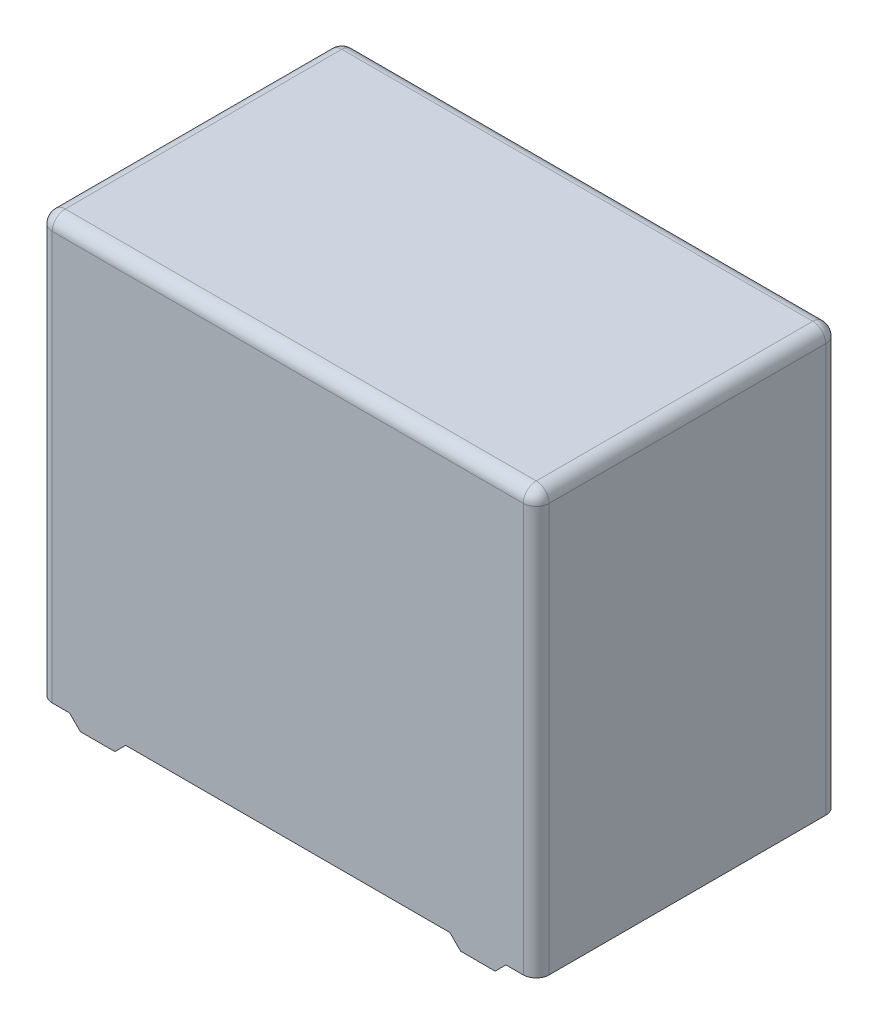
ISO-10303-21;
HEADER;
FILE_DESCRIPTION(('STEP AP214'),'2;1');
FILE_NAME('part.step','',(''),(''),'','','');
FILE_SCHEMA(('AUTOMOTIVE_DESIGN { 1 0 10303 214 1 1 1 1 }'));
ENDSEC;
DATA;
#1=APPLICATION_CONTEXT('core data for automotive mechanical design processes');
#2=APPLICATION_PROTOCOL_DEFINITION('international standard','automotive_design',2000,#1);
#3=PRODUCT_CONTEXT('',#1,'mechanical');
#4=PRODUCT('Part','Part','',(#3));
#5=PRODUCT_RELATED_PRODUCT_CATEGORY('part','',(#4));
#6=PRODUCT_DEFINITION_FORMATION('','',#4);
#7=PRODUCT_DEFINITION_CONTEXT('part definition',#1,'design');
#8=PRODUCT_DEFINITION('design','',#6,#7);
#9=PRODUCT_DEFINITION_SHAPE('','',#8);
#10=(LENGTH_UNIT() NAMED_UNIT(*) SI_UNIT(.MILLI.,.METRE.));
#11=(NAMED_UNIT(*) PLANE_ANGLE_UNIT() SI_UNIT($,.RADIAN.));
#12=(NAMED_UNIT(*) SI_UNIT($,.STERADIAN.) SOLID_ANGLE_UNIT());
#13=UNCERTAINTY_MEASURE_WITH_UNIT(LENGTH_MEASURE(1.E-05),#10,'distance_accuracy_value','');
#14=(GEOMETRIC_REPRESENTATION_CONTEXT(3) GLOBAL_UNCERTAINTY_ASSIGNED_CONTEXT((#13)) GLOBAL_UNIT_ASSIGNED_CONTEXT((#10,
#11,#12)) REPRESENTATION_CONTEXT('',''));
#15=CARTESIAN_POINT('',(0.,0.,0.));
#16=DIRECTION('',(0.,0.,1.));
#17=DIRECTION('',(1.,0.,0.));
#18=AXIS2_PLACEMENT_3D('',#15,#16,#17);
#19=CARTESIAN_POINT('',(28.75,-25.,17.5));
#20=DIRECTION('',(0.,1.,0.));
#21=DIRECTION('',(-1.,0.,0.));
#22=AXIS2_PLACEMENT_3D('',#19,#20,#21);
#23=PLANE('',#22);
#24=DIRECTION('',(0.,0.,1.));
#25=VECTOR('',#24,1.);
#26=CARTESIAN_POINT('',(24.0000000000001,-25.,-17.5));
#27=LINE('',#26,#25);
#28=CARTESIAN_POINT('',(24.0000000000001,-25.,-17.5));
#29=VERTEX_POINT('',#28);
#30=CARTESIAN_POINT('',(24.0000000000001,-25.,-16.));
#31=VERTEX_POINT('',#30);
#32=EDGE_CURVE('E11',#29,#31,#27,.T.);
#33=ORIENTED_EDGE('',*,*,#32,.T.);
#34=DIRECTION('',(-1.,0.,0.));
#35=VECTOR('',#34,1.);
#36=CARTESIAN_POINT('',(28.75,-25.,-16.));
#37=LINE('',#36,#35);
#38=CARTESIAN_POINT('',(20.,-25.,-16.));
#39=VERTEX_POINT('',#38);
#40=EDGE_CURVE('E24',#31,#39,#37,.T.);
#41=ORIENTED_EDGE('',*,*,#40,.T.);
#42=DIRECTION('',(0.,0.,1.));
#43=VECTOR('',#42,1.);
#44=CARTESIAN_POINT('',(20.,-25.,-17.5));
#45=LINE('',#44,#43);
#46=CARTESIAN_POINT('',(20.,-25.,-17.5));
#47=VERTEX_POINT('',#46);
#48=EDGE_CURVE('E373',#47,#39,#45,.T.);
#49=ORIENTED_EDGE('',*,*,#48,.F.);
#50=DIRECTION('',(1.,0.,0.));
#51=VECTOR('',#50,1.);
#52=CARTESIAN_POINT('',(28.75,-25.,-17.5));
#53=LINE('',#52,#51);
#54=EDGE_CURVE('E371',#47,#29,#53,.T.);
#55=ORIENTED_EDGE('',*,*,#54,.T.);
#56=EDGE_LOOP('',(#33,#41,#49,#55));
#57=FACE_BOUND('',#56,.T.);
#58=ADVANCED_FACE('F17',(#57),#23,.F.);
#59=CARTESIAN_POINT('',(28.75,-25.,17.5));
#60=DIRECTION('',(0.,1.,0.));
#61=DIRECTION('',(-1.,0.,0.));
#62=AXIS2_PLACEMENT_3D('',#59,#60,#61);
#63=PLANE('',#62);
#64=DIRECTION('',(0.,0.,1.));
#65=VECTOR('',#64,1.);
#66=CARTESIAN_POINT('',(-20.,-25.,-17.5));
#67=LINE('',#66,#65);
#68=CARTESIAN_POINT('',(-20.,-25.,-17.5));
#69=VERTEX_POINT('',#68);
#70=CARTESIAN_POINT('',(-20.,-25.,-16.));
#71=VERTEX_POINT('',#70);
#72=EDGE_CURVE('E369',#69,#71,#67,.T.);
#73=ORIENTED_EDGE('',*,*,#72,.T.);
#74=DIRECTION('',(-1.,0.,0.));
#75=VECTOR('',#74,1.);
#76=CARTESIAN_POINT('',(28.75,-25.,-16.));
#77=LINE('',#76,#75);
#78=CARTESIAN_POINT('',(-24.,-25.,-16.));
#79=VERTEX_POINT('',#78);
#80=EDGE_CURVE('E367',#71,#79,#77,.T.);
#81=ORIENTED_EDGE('',*,*,#80,.T.);
#82=DIRECTION('',(0.,0.,1.));
#83=VECTOR('',#82,1.);
#84=CARTESIAN_POINT('',(-24.,-25.,-17.5));
#85=LINE('',#84,#83);
#86=CARTESIAN_POINT('',(-24.,-25.,-17.5));
#87=VERTEX_POINT('',#86);
#88=EDGE_CURVE('E364',#87,#79,#85,.T.);
#89=ORIENTED_EDGE('',*,*,#88,.F.);
#90=DIRECTION('',(1.,0.,0.));
#91=VECTOR('',#90,1.);
#92=CARTESIAN_POINT('',(28.75,-25.,-17.5));
#93=LINE('',#92,#91);
#94=EDGE_CURVE('E361',#87,#69,#93,.T.);
#95=ORIENTED_EDGE('',*,*,#94,.T.);
#96=EDGE_LOOP('',(#73,#81,#89,#95));
#97=FACE_BOUND('',#96,.T.);
#98=ADVANCED_FACE('F390',(#97),#63,.F.);
#99=CARTESIAN_POINT('',(24.5000000000001,-24.4999999999999,-17.5));
#100=DIRECTION('',(0.707106781186551,-0.707106781186545,0.));
#101=DIRECTION('',(0.707106781186545,0.707106781186551,0.));
#102=AXIS2_PLACEMENT_3D('',#99,#100,#101);
#103=PLANE('',#102);
#104=DIRECTION('',(0.707106781186545,0.707106781186551,0.));
#105=VECTOR('',#104,1.);
#106=CARTESIAN_POINT('',(24.5000000000001,-24.4999999999999,-16.));
#107=LINE('',#106,#105);
#108=CARTESIAN_POINT('',(25.25,-23.75,-16.));
#109=VERTEX_POINT('',#108);
#110=EDGE_CURVE('E359',#31,#109,#107,.T.);
#111=ORIENTED_EDGE('',*,*,#110,.F.);
#112=ORIENTED_EDGE('',*,*,#32,.F.);
#113=DIRECTION('',(0.707106781186545,0.707106781186551,0.));
#114=VECTOR('',#113,1.);
#115=CARTESIAN_POINT('',(24.5000000000001,-24.4999999999999,-17.5));
#116=LINE('',#115,#114);
#117=CARTESIAN_POINT('',(25.25,-23.75,-17.5));
#118=VERTEX_POINT('',#117);
#119=EDGE_CURVE('E357',#29,#118,#116,.T.);
#120=ORIENTED_EDGE('',*,*,#119,.T.);
#121=DIRECTION('',(0.,0.,1.));
#122=VECTOR('',#121,1.);
#123=CARTESIAN_POINT('',(25.25,-23.75,-17.5));
#124=LINE('',#123,#122);
#125=EDGE_CURVE('E354',#118,#109,#124,.T.);
#126=ORIENTED_EDGE('',*,*,#125,.T.);
#127=EDGE_LOOP('',(#111,#112,#120,#126));
#128=FACE_BOUND('',#127,.T.);
#129=ADVANCED_FACE('F388',(#128),#103,.T.);
#130=CARTESIAN_POINT('',(-2.5000000000001,-2.5000000000001,-17.5));
#131=DIRECTION('',(-0.707106781186544,-0.707106781186552,0.));
#132=DIRECTION('',(0.707106781186552,-0.707106781186544,0.));
#133=AXIS2_PLACEMENT_3D('',#130,#131,#132);
#134=PLANE('',#133);
#135=DIRECTION('',(0.707106781186551,-0.707106781186544,0.));
#136=VECTOR('',#135,1.);
#137=CARTESIAN_POINT('',(-2.5000000000001,-2.5000000000001,-16.));
#138=LINE('',#137,#136);
#139=CARTESIAN_POINT('',(18.75,-23.75,-16.));
#140=VERTEX_POINT('',#139);
#141=EDGE_CURVE('E351',#140,#39,#138,.T.);
#142=ORIENTED_EDGE('',*,*,#141,.F.);
#143=DIRECTION('',(0.,0.,1.));
#144=VECTOR('',#143,1.);
#145=CARTESIAN_POINT('',(18.75,-23.75,-17.5));
#146=LINE('',#145,#144);
#147=CARTESIAN_POINT('',(18.75,-23.75,-17.5));
#148=VERTEX_POINT('',#147);
#149=EDGE_CURVE('E348',#148,#140,#146,.T.);
#150=ORIENTED_EDGE('',*,*,#149,.F.);
#151=DIRECTION('',(0.707106781186551,-0.707106781186544,0.));
#152=VECTOR('',#151,1.);
#153=CARTESIAN_POINT('',(-2.5000000000001,-2.5000000000001,-17.5));
#154=LINE('',#153,#152);
#155=EDGE_CURVE('E345',#148,#47,#154,.T.);
#156=ORIENTED_EDGE('',*,*,#155,.T.);
#157=ORIENTED_EDGE('',*,*,#48,.T.);
#158=EDGE_LOOP('',(#142,#150,#156,#157));
#159=FACE_BOUND('',#158,.T.);
#160=ADVANCED_FACE('F378',(#159),#134,.T.);
#161=CARTESIAN_POINT('',(2.5000000000001,-2.5000000000001,-17.5));
#162=DIRECTION('',(-0.707106781186544,0.707106781186552,0.));
#163=DIRECTION('',(-0.707106781186552,-0.707106781186544,0.));
#164=AXIS2_PLACEMENT_3D('',#161,#162,#163);
#165=PLANE('',#164);
#166=DIRECTION('',(0.,0.,1.));
#167=VECTOR('',#166,1.);
#168=CARTESIAN_POINT('',(-18.75,-23.75,-17.5));
#169=LINE('',#168,#167);
#170=CARTESIAN_POINT('',(-18.75,-23.75,-17.5));
#171=VERTEX_POINT('',#170);
#172=CARTESIAN_POINT('',(-18.75,-23.75,-16.));
#173=VERTEX_POINT('',#172);
#174=EDGE_CURVE('E343',#171,#173,#169,.T.);
#175=ORIENTED_EDGE('',*,*,#174,.T.);
#176=DIRECTION('',(-0.707106781186551,-0.707106781186544,0.));
#177=VECTOR('',#176,1.);
#178=CARTESIAN_POINT('',(2.5000000000001,-2.5000000000001,-16.));
#179=LINE('',#178,#177);
#180=EDGE_CURVE('E340',#173,#71,#179,.T.);
#181=ORIENTED_EDGE('',*,*,#180,.T.);
#182=ORIENTED_EDGE('',*,*,#72,.F.);
#183=DIRECTION('',(-0.707106781186551,-0.707106781186544,0.));
#184=VECTOR('',#183,1.);
#185=CARTESIAN_POINT('',(2.5000000000001,-2.5000000000001,-17.5));
#186=LINE('',#185,#184);
#187=EDGE_CURVE('E337',#171,#69,#186,.T.);
#188=ORIENTED_EDGE('',*,*,#187,.F.);
#189=EDGE_LOOP('',(#175,#181,#182,#188));
#190=FACE_BOUND('',#189,.T.);
#191=ADVANCED_FACE('F397',(#190),#165,.F.);
#192=CARTESIAN_POINT('',(-24.5000000000001,-24.4999999999999,-17.5));
#193=DIRECTION('',(0.707106781186551,0.707106781186545,0.));
#194=DIRECTION('',(-0.707106781186545,0.707106781186551,0.));
#195=AXIS2_PLACEMENT_3D('',#192,#193,#194);
#196=PLANE('',#195);
#197=ORIENTED_EDGE('',*,*,#88,.T.);
#198=DIRECTION('',(-0.707106781186545,0.707106781186551,0.));
#199=VECTOR('',#198,1.);
#200=CARTESIAN_POINT('',(-24.5000000000001,-24.4999999999999,-16.));
#201=LINE('',#200,#199);
#202=CARTESIAN_POINT('',(-25.25,-23.75,-16.));
#203=VERTEX_POINT('',#202);
#204=EDGE_CURVE('E335',#79,#203,#201,.T.);
#205=ORIENTED_EDGE('',*,*,#204,.T.);
#206=DIRECTION('',(0.,0.,1.));
#207=VECTOR('',#206,1.);
#208=CARTESIAN_POINT('',(-25.25,-23.75,-17.5));
#209=LINE('',#208,#207);
#210=CARTESIAN_POINT('',(-25.25,-23.75,-17.5));
#211=VERTEX_POINT('',#210);
#212=EDGE_CURVE('E332',#211,#203,#209,.T.);
#213=ORIENTED_EDGE('',*,*,#212,.F.);
#214=DIRECTION('',(-0.707106781186545,0.707106781186551,0.));
#215=VECTOR('',#214,1.);
#216=CARTESIAN_POINT('',(-24.5000000000001,-24.4999999999999,-17.5));
#217=LINE('',#216,#215);
#218=EDGE_CURVE('E329',#87,#211,#217,.T.);
#219=ORIENTED_EDGE('',*,*,#218,.F.);
#220=EDGE_LOOP('',(#197,#205,#213,#219));
#221=FACE_BOUND('',#220,.T.);
#222=ADVANCED_FACE('F434',(#221),#196,.F.);
#223=CARTESIAN_POINT('',(28.75,-25.,17.5));
#224=DIRECTION('',(0.,1.,0.));
#225=DIRECTION('',(-1.,0.,0.));
#226=AXIS2_PLACEMENT_3D('',#223,#224,#225);
#227=PLANE('',#226);
#228=DIRECTION('',(0.,0.,1.));
#229=VECTOR('',#228,1.);
#230=CARTESIAN_POINT('',(20.,-25.,-17.5));
#231=LINE('',#230,#229);
#232=CARTESIAN_POINT('',(20.,-25.,16.));
#233=VERTEX_POINT('',#232);
#234=CARTESIAN_POINT('',(20.,-25.,17.5));
#235=VERTEX_POINT('',#234);
#236=EDGE_CURVE('E327',#233,#235,#231,.T.);
#237=ORIENTED_EDGE('',*,*,#236,.F.);
#238=DIRECTION('',(1.,0.,0.));
#239=VECTOR('',#238,1.);
#240=CARTESIAN_POINT('',(28.75,-25.,16.));
#241=LINE('',#240,#239);
#242=CARTESIAN_POINT('',(24.0000000000001,-25.,16.));
#243=VERTEX_POINT('',#242);
#244=EDGE_CURVE('E325',#233,#243,#241,.T.);
#245=ORIENTED_EDGE('',*,*,#244,.T.);
#246=DIRECTION('',(0.,0.,1.));
#247=VECTOR('',#246,1.);
#248=CARTESIAN_POINT('',(24.0000000000001,-25.,-17.5));
#249=LINE('',#248,#247);
#250=CARTESIAN_POINT('',(24.0000000000001,-25.,17.5));
#251=VERTEX_POINT('',#250);
#252=EDGE_CURVE('E323',#243,#251,#249,.T.);
#253=ORIENTED_EDGE('',*,*,#252,.T.);
#254=DIRECTION('',(1.,0.,0.));
#255=VECTOR('',#254,1.);
#256=CARTESIAN_POINT('',(28.75,-25.,17.5));
#257=LINE('',#256,#255);
#258=EDGE_CURVE('E320',#235,#251,#257,.T.);
#259=ORIENTED_EDGE('',*,*,#258,.F.);
#260=EDGE_LOOP('',(#237,#245,#253,#259));
#261=FACE_BOUND('',#260,.T.);
#262=ADVANCED_FACE('F444',(#261),#227,.F.);
#263=CARTESIAN_POINT('',(28.75,-25.,17.5));
#264=DIRECTION('',(0.,1.,0.));
#265=DIRECTION('',(-1.,0.,0.));
#266=AXIS2_PLACEMENT_3D('',#263,#264,#265);
#267=PLANE('',#266);
#268=DIRECTION('',(0.,0.,1.));
#269=VECTOR('',#268,1.);
#270=CARTESIAN_POINT('',(-24.,-25.,-17.5));
#271=LINE('',#270,#269);
#272=CARTESIAN_POINT('',(-24.,-25.,16.));
#273=VERTEX_POINT('',#272);
#274=CARTESIAN_POINT('',(-24.,-25.,17.5));
#275=VERTEX_POINT('',#274);
#276=EDGE_CURVE('E318',#273,#275,#271,.T.);
#277=ORIENTED_EDGE('',*,*,#276,.F.);
#278=DIRECTION('',(1.,0.,0.));
#279=VECTOR('',#278,1.);
#280=CARTESIAN_POINT('',(28.75,-25.,16.));
#281=LINE('',#280,#279);
#282=CARTESIAN_POINT('',(-20.,-25.,16.));
#283=VERTEX_POINT('',#282);
#284=EDGE_CURVE('E203',#273,#283,#281,.T.);
#285=ORIENTED_EDGE('',*,*,#284,.T.);
#286=DIRECTION('',(0.,0.,1.));
#287=VECTOR('',#286,1.);
#288=CARTESIAN_POINT('',(-20.,-25.,-17.5));
#289=LINE('',#288,#287);
#290=CARTESIAN_POINT('',(-20.,-25.,17.5));
#291=VERTEX_POINT('',#290);
#292=EDGE_CURVE('E315',#283,#291,#289,.T.);
#293=ORIENTED_EDGE('',*,*,#292,.T.);
#294=DIRECTION('',(1.,0.,0.));
#295=VECTOR('',#294,1.);
#296=CARTESIAN_POINT('',(28.75,-25.,17.5));
#297=LINE('',#296,#295);
#298=EDGE_CURVE('E312',#275,#291,#297,.T.);
#299=ORIENTED_EDGE('',*,*,#298,.F.);
#300=EDGE_LOOP('',(#277,#285,#293,#299));
#301=FACE_BOUND('',#300,.T.);
#302=ADVANCED_FACE('F454',(#301),#267,.F.);
#303=CARTESIAN_POINT('',(28.75,-25.,17.5));
#304=DIRECTION('',(-1.,0.,0.));
#305=DIRECTION('',(0.,0.,1.));
#306=AXIS2_PLACEMENT_3D('',#303,#304,#305);
#307=PLANE('',#306);
#308=DIRECTION('',(0.,0.,1.));
#309=VECTOR('',#308,1.);
#310=CARTESIAN_POINT('',(28.75,-23.75,-17.5));
#311=LINE('',#310,#309);
#312=CARTESIAN_POINT('',(28.75,-23.75,-16.));
#313=VERTEX_POINT('',#312);
#314=CARTESIAN_POINT('',(28.75,-23.75,16.));
#315=VERTEX_POINT('',#314);
#316=EDGE_CURVE('E310',#313,#315,#311,.T.);
#317=ORIENTED_EDGE('',*,*,#316,.F.);
#318=DIRECTION('',(0.,1.,0.));
#319=VECTOR('',#318,1.);
#320=CARTESIAN_POINT('',(28.75,-25.,-16.));
#321=LINE('',#320,#319);
#322=CARTESIAN_POINT('',(28.75,23.5,-16.));
#323=VERTEX_POINT('',#322);
#324=EDGE_CURVE('E308',#313,#323,#321,.T.);
#325=ORIENTED_EDGE('',*,*,#324,.T.);
#326=DIRECTION('',(0.,0.,1.));
#327=VECTOR('',#326,1.);
#328=CARTESIAN_POINT('',(28.75,23.5,17.5));
#329=LINE('',#328,#327);
#330=CARTESIAN_POINT('',(28.75,23.5,16.));
#331=VERTEX_POINT('',#330);
#332=EDGE_CURVE('E306',#323,#331,#329,.T.);
#333=ORIENTED_EDGE('',*,*,#332,.T.);
#334=DIRECTION('',(0.,-1.,0.));
#335=VECTOR('',#334,1.);
#336=CARTESIAN_POINT('',(28.75,-23.75,16.));
#337=LINE('',#336,#335);
#338=EDGE_CURVE('E303',#331,#315,#337,.T.);
#339=ORIENTED_EDGE('',*,*,#338,.T.);
#340=EDGE_LOOP('',(#317,#325,#333,#339));
#341=FACE_BOUND('',#340,.T.);
#342=ADVANCED_FACE('F464',(#341),#307,.F.);
#343=CARTESIAN_POINT('',(0.,0.,17.5));
#344=DIRECTION('',(0.,0.,1.));
#345=DIRECTION('',(1.,0.,0.));
#346=AXIS2_PLACEMENT_3D('',#343,#344,#345);
#347=PLANE('',#346);
#348=DIRECTION('',(1.,0.,0.));
#349=VECTOR('',#348,1.);
#350=CARTESIAN_POINT('',(0.,-23.75,17.5));
#351=LINE('',#350,#349);
#352=CARTESIAN_POINT('',(25.25,-23.75,17.5));
#353=VERTEX_POINT('',#352);
#354=CARTESIAN_POINT('',(27.25,-23.75,17.5));
#355=VERTEX_POINT('',#354);
#356=EDGE_CURVE('E301',#353,#355,#351,.T.);
#357=ORIENTED_EDGE('',*,*,#356,.T.);
#358=DIRECTION('',(0.,1.,0.));
#359=VECTOR('',#358,1.);
#360=CARTESIAN_POINT('',(27.25,25.,17.5));
#361=LINE('',#360,#359);
#362=CARTESIAN_POINT('',(27.25,23.5,17.5));
#363=VERTEX_POINT('',#362);
#364=EDGE_CURVE('E299',#355,#363,#361,.T.);
#365=ORIENTED_EDGE('',*,*,#364,.T.);
#366=DIRECTION('',(-1.,0.,0.));
#367=VECTOR('',#366,1.);
#368=CARTESIAN_POINT('',(-28.75,23.5,17.5));
#369=LINE('',#368,#367);
#370=CARTESIAN_POINT('',(-27.25,23.5,17.5));
#371=VERTEX_POINT('',#370);
#372=EDGE_CURVE('E297',#363,#371,#369,.T.);
#373=ORIENTED_EDGE('',*,*,#372,.T.);
#374=DIRECTION('',(0.,-1.,0.));
#375=VECTOR('',#374,1.);
#376=CARTESIAN_POINT('',(-27.25,-23.75,17.5));
#377=LINE('',#376,#375);
#378=CARTESIAN_POINT('',(-27.25,-23.75,17.5));
#379=VERTEX_POINT('',#378);
#380=EDGE_CURVE('E295',#371,#379,#377,.T.);
#381=ORIENTED_EDGE('',*,*,#380,.T.);
#382=DIRECTION('',(-1.,0.,0.));
#383=VECTOR('',#382,1.);
#384=CARTESIAN_POINT('',(0.,-23.75,17.5));
#385=LINE('',#384,#383);
#386=CARTESIAN_POINT('',(-25.25,-23.75,17.5));
#387=VERTEX_POINT('',#386);
#388=EDGE_CURVE('E293',#387,#379,#385,.T.);
#389=ORIENTED_EDGE('',*,*,#388,.F.);
#390=DIRECTION('',(-0.707106781186545,0.707106781186551,0.));
#391=VECTOR('',#390,1.);
#392=CARTESIAN_POINT('',(-24.5000000000001,-24.4999999999999,17.5));
#393=LINE('',#392,#391);
#394=EDGE_CURVE('E191',#275,#387,#393,.T.);
#395=ORIENTED_EDGE('',*,*,#394,.F.);
#396=ORIENTED_EDGE('',*,*,#298,.T.);
#397=DIRECTION('',(-0.707106781186551,-0.707106781186544,0.));
#398=VECTOR('',#397,1.);
#399=CARTESIAN_POINT('',(2.5000000000001,-2.5000000000001,17.5));
#400=LINE('',#399,#398);
#401=CARTESIAN_POINT('',(-18.75,-23.75,17.5));
#402=VERTEX_POINT('',#401);
#403=EDGE_CURVE('E289',#402,#291,#400,.T.);
#404=ORIENTED_EDGE('',*,*,#403,.F.);
#405=DIRECTION('',(-1.,0.,0.));
#406=VECTOR('',#405,1.);
#407=CARTESIAN_POINT('',(0.,-23.75,17.5));
#408=LINE('',#407,#406);
#409=CARTESIAN_POINT('',(18.75,-23.75,17.5));
#410=VERTEX_POINT('',#409);
#411=EDGE_CURVE('E287',#410,#402,#408,.T.);
#412=ORIENTED_EDGE('',*,*,#411,.F.);
#413=DIRECTION('',(0.707106781186551,-0.707106781186544,0.));
#414=VECTOR('',#413,1.);
#415=CARTESIAN_POINT('',(-2.5000000000001,-2.5000000000001,17.5));
#416=LINE('',#415,#414);
#417=EDGE_CURVE('E284',#410,#235,#416,.T.);
#418=ORIENTED_EDGE('',*,*,#417,.T.);
#419=ORIENTED_EDGE('',*,*,#258,.T.);
#420=DIRECTION('',(0.707106781186545,0.707106781186551,0.));
#421=VECTOR('',#420,1.);
#422=CARTESIAN_POINT('',(24.5000000000001,-24.4999999999999,17.5));
#423=LINE('',#422,#421);
#424=EDGE_CURVE('E281',#251,#353,#423,.T.);
#425=ORIENTED_EDGE('',*,*,#424,.T.);
#426=EDGE_LOOP('',(#357,#365,#373,#381,#389,#395,#396,#404,#412,#418,#419,#425));
#427=FACE_BOUND('',#426,.T.);
#428=ADVANCED_FACE('F474',(#427),#347,.T.);
#429=CARTESIAN_POINT('',(0.,0.,-17.5));
#430=DIRECTION('',(0.,0.,1.));
#431=DIRECTION('',(1.,0.,0.));
#432=AXIS2_PLACEMENT_3D('',#429,#430,#431);
#433=PLANE('',#432);
#434=DIRECTION('',(-1.,0.,0.));
#435=VECTOR('',#434,1.);
#436=CARTESIAN_POINT('',(0.,-23.75,-17.5));
#437=LINE('',#436,#435);
#438=CARTESIAN_POINT('',(-27.25,-23.75,-17.5));
#439=VERTEX_POINT('',#438);
#440=EDGE_CURVE('E279',#211,#439,#437,.T.);
#441=ORIENTED_EDGE('',*,*,#440,.T.);
#442=DIRECTION('',(0.,1.,0.));
#443=VECTOR('',#442,1.);
#444=CARTESIAN_POINT('',(-27.25,0.,-17.5));
#445=LINE('',#444,#443);
#446=CARTESIAN_POINT('',(-27.25,23.5,-17.5));
#447=VERTEX_POINT('',#446);
#448=EDGE_CURVE('E277',#439,#447,#445,.T.);
#449=ORIENTED_EDGE('',*,*,#448,.T.);
#450=DIRECTION('',(1.,0.,0.));
#451=VECTOR('',#450,1.);
#452=CARTESIAN_POINT('',(0.,23.5,-17.5));
#453=LINE('',#452,#451);
#454=CARTESIAN_POINT('',(27.25,23.5,-17.5));
#455=VERTEX_POINT('',#454);
#456=EDGE_CURVE('E275',#447,#455,#453,.T.);
#457=ORIENTED_EDGE('',*,*,#456,.T.);
#458=DIRECTION('',(0.,-1.,0.));
#459=VECTOR('',#458,1.);
#460=CARTESIAN_POINT('',(27.25,0.,-17.5));
#461=LINE('',#460,#459);
#462=CARTESIAN_POINT('',(27.25,-23.75,-17.5));
#463=VERTEX_POINT('',#462);
#464=EDGE_CURVE('E273',#455,#463,#461,.T.);
#465=ORIENTED_EDGE('',*,*,#464,.T.);
#466=DIRECTION('',(1.,0.,0.));
#467=VECTOR('',#466,1.);
#468=CARTESIAN_POINT('',(0.,-23.75,-17.5));
#469=LINE('',#468,#467);
#470=EDGE_CURVE('E270',#118,#463,#469,.T.);
#471=ORIENTED_EDGE('',*,*,#470,.F.);
#472=ORIENTED_EDGE('',*,*,#119,.F.);
#473=ORIENTED_EDGE('',*,*,#54,.F.);
#474=ORIENTED_EDGE('',*,*,#155,.F.);
#475=DIRECTION('',(-1.,0.,0.));
#476=VECTOR('',#475,1.);
#477=CARTESIAN_POINT('',(0.,-23.75,-17.5));
#478=LINE('',#477,#476);
#479=EDGE_CURVE('E267',#148,#171,#478,.T.);
#480=ORIENTED_EDGE('',*,*,#479,.T.);
#481=ORIENTED_EDGE('',*,*,#187,.T.);
#482=ORIENTED_EDGE('',*,*,#94,.F.);
#483=ORIENTED_EDGE('',*,*,#218,.T.);
#484=EDGE_LOOP('',(#441,#449,#457,#465,#471,#472,#473,#474,#480,#481,#482,#483));
#485=FACE_BOUND('',#484,.T.);
#486=ADVANCED_FACE('F386',(#485),#433,.F.);
#487=CARTESIAN_POINT('',(-28.75,-25.,17.5));
#488=DIRECTION('',(1.,0.,0.));
#489=DIRECTION('',(0.,0.,-1.));
#490=AXIS2_PLACEMENT_3D('',#487,#488,#489);
#491=PLANE('',#490);
#492=DIRECTION('',(0.,0.,-1.));
#493=VECTOR('',#492,1.);
#494=CARTESIAN_POINT('',(-28.75,23.5,17.5));
#495=LINE('',#494,#493);
#496=CARTESIAN_POINT('',(-28.75,23.5,16.));
#497=VERTEX_POINT('',#496);
#498=CARTESIAN_POINT('',(-28.75,23.5,-16.));
#499=VERTEX_POINT('',#498);
#500=EDGE_CURVE('E265',#497,#499,#495,.T.);
#501=ORIENTED_EDGE('',*,*,#500,.T.);
#502=DIRECTION('',(0.,-1.,0.));
#503=VECTOR('',#502,1.);
#504=CARTESIAN_POINT('',(-28.75,-25.,-16.));
#505=LINE('',#504,#503);
#506=CARTESIAN_POINT('',(-28.75,-23.75,-16.));
#507=VERTEX_POINT('',#506);
#508=EDGE_CURVE('E263',#499,#507,#505,.T.);
#509=ORIENTED_EDGE('',*,*,#508,.T.);
#510=DIRECTION('',(0.,0.,1.));
#511=VECTOR('',#510,1.);
#512=CARTESIAN_POINT('',(-28.75,-23.75,-17.5));
#513=LINE('',#512,#511);
#514=CARTESIAN_POINT('',(-28.75,-23.75,16.));
#515=VERTEX_POINT('',#514);
#516=EDGE_CURVE('E261',#507,#515,#513,.T.);
#517=ORIENTED_EDGE('',*,*,#516,.T.);
#518=DIRECTION('',(0.,1.,0.));
#519=VECTOR('',#518,1.);
#520=CARTESIAN_POINT('',(-28.75,25.,16.));
#521=LINE('',#520,#519);
#522=EDGE_CURVE('E258',#515,#497,#521,.T.);
#523=ORIENTED_EDGE('',*,*,#522,.T.);
#524=EDGE_LOOP('',(#501,#509,#517,#523));
#525=FACE_BOUND('',#524,.T.);
#526=ADVANCED_FACE('F493',(#525),#491,.F.);
#527=CARTESIAN_POINT('',(28.75,25.,17.5));
#528=DIRECTION('',(0.,-1.,0.));
#529=DIRECTION('',(1.,0.,0.));
#530=AXIS2_PLACEMENT_3D('',#527,#528,#529);
#531=PLANE('',#530);
#532=DIRECTION('',(1.,0.,0.));
#533=VECTOR('',#532,1.);
#534=CARTESIAN_POINT('',(28.75,25.,16.));
#535=LINE('',#534,#533);
#536=CARTESIAN_POINT('',(-27.25,25.,16.));
#537=VERTEX_POINT('',#536);
#538=CARTESIAN_POINT('',(27.25,25.,16.));
#539=VERTEX_POINT('',#538);
#540=EDGE_CURVE('E256',#537,#539,#535,.T.);
#541=ORIENTED_EDGE('',*,*,#540,.T.);
#542=DIRECTION('',(0.,0.,-1.));
#543=VECTOR('',#542,1.);
#544=CARTESIAN_POINT('',(27.25,25.,17.5));
#545=LINE('',#544,#543);
#546=CARTESIAN_POINT('',(27.25,25.,-16.));
#547=VERTEX_POINT('',#546);
#548=EDGE_CURVE('E254',#539,#547,#545,.T.);
#549=ORIENTED_EDGE('',*,*,#548,.T.);
#550=DIRECTION('',(-1.,0.,0.));
#551=VECTOR('',#550,1.);
#552=CARTESIAN_POINT('',(28.75,25.,-16.));
#553=LINE('',#552,#551);
#554=CARTESIAN_POINT('',(-27.25,25.,-16.));
#555=VERTEX_POINT('',#554);
#556=EDGE_CURVE('E252',#547,#555,#553,.T.);
#557=ORIENTED_EDGE('',*,*,#556,.T.);
#558=DIRECTION('',(0.,0.,1.));
#559=VECTOR('',#558,1.);
#560=CARTESIAN_POINT('',(-27.25,25.,17.5));
#561=LINE('',#560,#559);
#562=EDGE_CURVE('E249',#555,#537,#561,.T.);
#563=ORIENTED_EDGE('',*,*,#562,.T.);
#564=EDGE_LOOP('',(#541,#549,#557,#563));
#565=FACE_BOUND('',#564,.T.);
#566=ADVANCED_FACE('F502',(#565),#531,.F.);
#567=CARTESIAN_POINT('',(24.5000000000001,-24.4999999999999,-17.5));
#568=DIRECTION('',(0.707106781186551,-0.707106781186545,0.));
#569=DIRECTION('',(0.707106781186545,0.707106781186551,0.));
#570=AXIS2_PLACEMENT_3D('',#567,#568,#569);
#571=PLANE('',#570);
#572=DIRECTION('',(-0.707106781186545,-0.707106781186551,0.));
#573=VECTOR('',#572,1.);
#574=CARTESIAN_POINT('',(24.5000000000001,-24.4999999999999,16.));
#575=LINE('',#574,#573);
#576=CARTESIAN_POINT('',(25.25,-23.75,16.));
#577=VERTEX_POINT('',#576);
#578=EDGE_CURVE('E246',#577,#243,#575,.T.);
#579=ORIENTED_EDGE('',*,*,#578,.F.);
#580=DIRECTION('',(0.,0.,1.));
#581=VECTOR('',#580,1.);
#582=CARTESIAN_POINT('',(25.25,-23.75,-17.5));
#583=LINE('',#582,#581);
#584=EDGE_CURVE('E243',#577,#353,#583,.T.);
#585=ORIENTED_EDGE('',*,*,#584,.T.);
#586=ORIENTED_EDGE('',*,*,#424,.F.);
#587=ORIENTED_EDGE('',*,*,#252,.F.);
#588=EDGE_LOOP('',(#579,#585,#586,#587));
#589=FACE_BOUND('',#588,.T.);
#590=ADVANCED_FACE('F512',(#589),#571,.T.);
#591=CARTESIAN_POINT('',(-2.5000000000001,-2.5000000000001,-17.5));
#592=DIRECTION('',(-0.707106781186544,-0.707106781186552,0.));
#593=DIRECTION('',(0.707106781186552,-0.707106781186544,0.));
#594=AXIS2_PLACEMENT_3D('',#591,#592,#593);
#595=PLANE('',#594);
#596=DIRECTION('',(-0.707106781186551,0.707106781186544,0.));
#597=VECTOR('',#596,1.);
#598=CARTESIAN_POINT('',(-2.5000000000001,-2.5000000000001,16.));
#599=LINE('',#598,#597);
#600=CARTESIAN_POINT('',(18.75,-23.75,16.));
#601=VERTEX_POINT('',#600);
#602=EDGE_CURVE('E241',#233,#601,#599,.T.);
#603=ORIENTED_EDGE('',*,*,#602,.F.);
#604=ORIENTED_EDGE('',*,*,#236,.T.);
#605=ORIENTED_EDGE('',*,*,#417,.F.);
#606=DIRECTION('',(0.,0.,1.));
#607=VECTOR('',#606,1.);
#608=CARTESIAN_POINT('',(18.75,-23.75,-17.5));
#609=LINE('',#608,#607);
#610=EDGE_CURVE('E238',#601,#410,#609,.T.);
#611=ORIENTED_EDGE('',*,*,#610,.F.);
#612=EDGE_LOOP('',(#603,#604,#605,#611));
#613=FACE_BOUND('',#612,.T.);
#614=ADVANCED_FACE('F522',(#613),#595,.T.);
#615=CARTESIAN_POINT('',(2.5000000000001,-2.5000000000001,-17.5));
#616=DIRECTION('',(-0.707106781186544,0.707106781186552,0.));
#617=DIRECTION('',(-0.707106781186552,-0.707106781186544,0.));
#618=AXIS2_PLACEMENT_3D('',#615,#616,#617);
#619=PLANE('',#618);
#620=ORIENTED_EDGE('',*,*,#292,.F.);
#621=DIRECTION('',(0.707106781186551,0.707106781186544,0.));
#622=VECTOR('',#621,1.);
#623=CARTESIAN_POINT('',(2.5000000000001,-2.5000000000001,16.));
#624=LINE('',#623,#622);
#625=CARTESIAN_POINT('',(-18.75,-23.75,16.));
#626=VERTEX_POINT('',#625);
#627=EDGE_CURVE('E236',#283,#626,#624,.T.);
#628=ORIENTED_EDGE('',*,*,#627,.T.);
#629=DIRECTION('',(0.,0.,1.));
#630=VECTOR('',#629,1.);
#631=CARTESIAN_POINT('',(-18.75,-23.75,-17.5));
#632=LINE('',#631,#630);
#633=EDGE_CURVE('E195',#626,#402,#632,.T.);
#634=ORIENTED_EDGE('',*,*,#633,.T.);
#635=ORIENTED_EDGE('',*,*,#403,.T.);
#636=EDGE_LOOP('',(#620,#628,#634,#635));
#637=FACE_BOUND('',#636,.T.);
#638=ADVANCED_FACE('F532',(#637),#619,.F.);
#639=CARTESIAN_POINT('',(-24.5000000000001,-24.4999999999999,-17.5));
#640=DIRECTION('',(0.707106781186551,0.707106781186545,0.));
#641=DIRECTION('',(-0.707106781186545,0.707106781186551,0.));
#642=AXIS2_PLACEMENT_3D('',#639,#640,#641);
#643=PLANE('',#642);
#644=DIRECTION('',(0.,0.,1.));
#645=VECTOR('',#644,1.);
#646=CARTESIAN_POINT('',(-25.25,-23.75,-17.5));
#647=LINE('',#646,#645);
#648=CARTESIAN_POINT('',(-25.25,-23.75,16.));
#649=VERTEX_POINT('',#648);
#650=EDGE_CURVE('E186',#649,#387,#647,.T.);
#651=ORIENTED_EDGE('',*,*,#650,.F.);
#652=DIRECTION('',(0.707106781186545,-0.707106781186551,0.));
#653=VECTOR('',#652,1.);
#654=CARTESIAN_POINT('',(-24.5000000000001,-24.4999999999999,16.));
#655=LINE('',#654,#653);
#656=EDGE_CURVE('E189',#649,#273,#655,.T.);
#657=ORIENTED_EDGE('',*,*,#656,.T.);
#658=ORIENTED_EDGE('',*,*,#276,.T.);
#659=ORIENTED_EDGE('',*,*,#394,.T.);
#660=EDGE_LOOP('',(#651,#657,#658,#659));
#661=FACE_BOUND('',#660,.T.);
#662=ADVANCED_FACE('F188',(#661),#643,.F.);
#663=CARTESIAN_POINT('',(0.,-23.75,-17.5));
#664=DIRECTION('',(0.,1.,0.));
#665=DIRECTION('',(-1.,0.,0.));
#666=AXIS2_PLACEMENT_3D('',#663,#664,#665);
#667=PLANE('',#666);
#668=ORIENTED_EDGE('',*,*,#516,.F.);
#669=CARTESIAN_POINT('',(-27.25,-23.75,-16.));
#670=DIRECTION('',(0.,-1.,0.));
#671=DIRECTION('',(-1.,0.,0.));
#672=AXIS2_PLACEMENT_3D('',#669,#670,#671);
#673=CIRCLE('',#672,1.5);
#674=EDGE_CURVE('E204',#507,#439,#673,.T.);
#675=ORIENTED_EDGE('',*,*,#674,.T.);
#676=ORIENTED_EDGE('',*,*,#440,.F.);
#677=ORIENTED_EDGE('',*,*,#212,.T.);
#678=DIRECTION('',(-1.,0.,0.));
#679=VECTOR('',#678,1.);
#680=CARTESIAN_POINT('',(28.75,-23.75,-16.));
#681=LINE('',#680,#679);
#682=EDGE_CURVE('E230',#173,#203,#681,.T.);
#683=ORIENTED_EDGE('',*,*,#682,.F.);
#684=ORIENTED_EDGE('',*,*,#174,.F.);
#685=ORIENTED_EDGE('',*,*,#479,.F.);
#686=ORIENTED_EDGE('',*,*,#149,.T.);
#687=DIRECTION('',(-1.,0.,0.));
#688=VECTOR('',#687,1.);
#689=CARTESIAN_POINT('',(28.75,-23.75,-16.));
#690=LINE('',#689,#688);
#691=EDGE_CURVE('E227',#109,#140,#690,.T.);
#692=ORIENTED_EDGE('',*,*,#691,.F.);
#693=ORIENTED_EDGE('',*,*,#125,.F.);
#694=ORIENTED_EDGE('',*,*,#470,.T.);
#695=CARTESIAN_POINT('',(27.25,-23.7500000000001,-16.));
#696=DIRECTION('',(0.,-1.,0.));
#697=DIRECTION('',(-1.,0.,0.));
#698=AXIS2_PLACEMENT_3D('',#695,#696,#697);
#699=CIRCLE('',#698,1.5);
#700=EDGE_CURVE('E224',#463,#313,#699,.T.);
#701=ORIENTED_EDGE('',*,*,#700,.T.);
#702=ORIENTED_EDGE('',*,*,#316,.T.);
#703=CARTESIAN_POINT('',(27.25,-23.7500000000001,16.));
#704=DIRECTION('',(0.,-1.,0.));
#705=DIRECTION('',(-1.,0.,0.));
#706=AXIS2_PLACEMENT_3D('',#703,#704,#705);
#707=CIRCLE('',#706,1.5);
#708=EDGE_CURVE('E215',#315,#355,#707,.T.);
#709=ORIENTED_EDGE('',*,*,#708,.T.);
#710=ORIENTED_EDGE('',*,*,#356,.F.);
#711=ORIENTED_EDGE('',*,*,#584,.F.);
#712=DIRECTION('',(-1.,0.,0.));
#713=VECTOR('',#712,1.);
#714=CARTESIAN_POINT('',(28.75,-23.75,16.));
#715=LINE('',#714,#713);
#716=EDGE_CURVE('E211',#577,#601,#715,.T.);
#717=ORIENTED_EDGE('',*,*,#716,.T.);
#718=ORIENTED_EDGE('',*,*,#610,.T.);
#719=ORIENTED_EDGE('',*,*,#411,.T.);
#720=ORIENTED_EDGE('',*,*,#633,.F.);
#721=DIRECTION('',(-1.,0.,0.));
#722=VECTOR('',#721,1.);
#723=CARTESIAN_POINT('',(28.75,-23.75,16.));
#724=LINE('',#723,#722);
#725=EDGE_CURVE('E202',#626,#649,#724,.T.);
#726=ORIENTED_EDGE('',*,*,#725,.T.);
#727=ORIENTED_EDGE('',*,*,#650,.T.);
#728=ORIENTED_EDGE('',*,*,#388,.T.);
#729=CARTESIAN_POINT('',(-27.25,-23.75,16.));
#730=DIRECTION('',(0.,-1.,0.));
#731=DIRECTION('',(-1.,0.,0.));
#732=AXIS2_PLACEMENT_3D('',#729,#730,#731);
#733=CIRCLE('',#732,1.5);
#734=EDGE_CURVE('E212',#379,#515,#733,.T.);
#735=ORIENTED_EDGE('',*,*,#734,.T.);
#736=EDGE_LOOP('',(#668,#675,#676,#677,#683,#684,#685,#686,#692,#693,#694,#701,#702,#709,#710,
#711,#717,#718,#719,#720,#726,#727,#728,#735));
#737=FACE_BOUND('',#736,.T.);
#738=ADVANCED_FACE('F208',(#737),#667,.F.);
#739=CARTESIAN_POINT('',(28.75,-26.25,16.));
#740=DIRECTION('',(0.,0.,1.));
#741=DIRECTION('',(1.,0.,0.));
#742=AXIS2_PLACEMENT_3D('',#739,#740,#741);
#743=PLANE('',#742);
#744=ORIENTED_EDGE('',*,*,#284,.F.);
#745=ORIENTED_EDGE('',*,*,#656,.F.);
#746=ORIENTED_EDGE('',*,*,#725,.F.);
#747=ORIENTED_EDGE('',*,*,#627,.F.);
#748=EDGE_LOOP('',(#744,#745,#746,#747));
#749=FACE_BOUND('',#748,.T.);
#750=ADVANCED_FACE('F200',(#749),#743,.F.);
#751=CARTESIAN_POINT('',(28.75,-26.25,-16.));
#752=DIRECTION('',(0.,0.,-1.));
#753=DIRECTION('',(-1.,0.,0.));
#754=AXIS2_PLACEMENT_3D('',#751,#752,#753);
#755=PLANE('',#754);
#756=ORIENTED_EDGE('',*,*,#682,.T.);
#757=ORIENTED_EDGE('',*,*,#204,.F.);
#758=ORIENTED_EDGE('',*,*,#80,.F.);
#759=ORIENTED_EDGE('',*,*,#180,.F.);
#760=EDGE_LOOP('',(#756,#757,#758,#759));
#761=FACE_BOUND('',#760,.T.);
#762=ADVANCED_FACE('F567',(#761),#755,.F.);
#763=CARTESIAN_POINT('',(28.75,-26.25,-16.));
#764=DIRECTION('',(0.,0.,-1.));
#765=DIRECTION('',(-1.,0.,0.));
#766=AXIS2_PLACEMENT_3D('',#763,#764,#765);
#767=PLANE('',#766);
#768=ORIENTED_EDGE('',*,*,#110,.T.);
#769=ORIENTED_EDGE('',*,*,#691,.T.);
#770=ORIENTED_EDGE('',*,*,#141,.T.);
#771=ORIENTED_EDGE('',*,*,#40,.F.);
#772=EDGE_LOOP('',(#768,#769,#770,#771));
#773=FACE_BOUND('',#772,.T.);
#774=ADVANCED_FACE('F380',(#773),#767,.F.);
#775=CARTESIAN_POINT('',(28.75,-26.25,16.));
#776=DIRECTION('',(0.,0.,1.));
#777=DIRECTION('',(1.,0.,0.));
#778=AXIS2_PLACEMENT_3D('',#775,#776,#777);
#779=PLANE('',#778);
#780=ORIENTED_EDGE('',*,*,#578,.T.);
#781=ORIENTED_EDGE('',*,*,#244,.F.);
#782=ORIENTED_EDGE('',*,*,#602,.T.);
#783=ORIENTED_EDGE('',*,*,#716,.F.);
#784=EDGE_LOOP('',(#780,#781,#782,#783));
#785=FACE_BOUND('',#784,.T.);
#786=ADVANCED_FACE('F585',(#785),#779,.F.);
#787=CARTESIAN_POINT('',(-27.25,0.,16.));
#788=DIRECTION('',(0.,1.,0.));
#789=DIRECTION('',(0.,0.,1.));
#790=AXIS2_PLACEMENT_3D('',#787,#788,#789);
#791=CYLINDRICAL_SURFACE('',#790,1.5);
#792=ORIENTED_EDGE('',*,*,#734,.F.);
#793=ORIENTED_EDGE('',*,*,#380,.F.);
#794=CARTESIAN_POINT('',(-27.25,23.5,16.));
#795=DIRECTION('',(0.,1.,0.));
#796=DIRECTION('',(0.,0.,1.));
#797=AXIS2_PLACEMENT_3D('',#794,#795,#796);
#798=CIRCLE('',#797,1.5);
#799=EDGE_CURVE('E218',#497,#371,#798,.T.);
#800=ORIENTED_EDGE('',*,*,#799,.F.);
#801=ORIENTED_EDGE('',*,*,#522,.F.);
#802=EDGE_LOOP('',(#792,#793,#800,#801));
#803=FACE_BOUND('',#802,.T.);
#804=ADVANCED_FACE('F594',(#803),#791,.T.);
#805=CARTESIAN_POINT('',(-27.25,23.5,17.5));
#806=DIRECTION('',(0.,0.,-1.));
#807=DIRECTION('',(-1.,0.,0.));
#808=AXIS2_PLACEMENT_3D('',#805,#806,#807);
#809=CYLINDRICAL_SURFACE('',#808,1.5);
#810=CARTESIAN_POINT('',(-27.25,23.5,-16.));
#811=DIRECTION('',(0.,0.,-1.));
#812=DIRECTION('',(-1.,0.,0.));
#813=AXIS2_PLACEMENT_3D('',#810,#811,#812);
#814=CIRCLE('',#813,1.5);
#815=EDGE_CURVE('E754',#499,#555,#814,.T.);
#816=ORIENTED_EDGE('',*,*,#815,.F.);
#817=ORIENTED_EDGE('',*,*,#500,.F.);
#818=CARTESIAN_POINT('',(-27.25,23.5,16.));
#819=DIRECTION('',(0.,0.,1.));
#820=DIRECTION('',(1.,0.,0.));
#821=AXIS2_PLACEMENT_3D('',#818,#819,#820);
#822=CIRCLE('',#821,1.5);
#823=EDGE_CURVE('E751',#537,#497,#822,.T.);
#824=ORIENTED_EDGE('',*,*,#823,.F.);
#825=ORIENTED_EDGE('',*,*,#562,.F.);
#826=EDGE_LOOP('',(#816,#817,#824,#825));
#827=FACE_BOUND('',#826,.T.);
#828=ADVANCED_FACE('F604',(#827),#809,.T.);
#829=CARTESIAN_POINT('',(-27.25,-25.,-16.));
#830=DIRECTION('',(0.,-1.,0.));
#831=DIRECTION('',(0.,0.,-1.));
#832=AXIS2_PLACEMENT_3D('',#829,#830,#831);
#833=CYLINDRICAL_SURFACE('',#832,1.5);
#834=ORIENTED_EDGE('',*,*,#674,.F.);
#835=ORIENTED_EDGE('',*,*,#508,.F.);
#836=CARTESIAN_POINT('',(-27.25,23.5,-16.));
#837=DIRECTION('',(0.,1.,0.));
#838=DIRECTION('',(0.,0.,1.));
#839=AXIS2_PLACEMENT_3D('',#836,#837,#838);
#840=CIRCLE('',#839,1.5);
#841=EDGE_CURVE('E748',#447,#499,#840,.T.);
#842=ORIENTED_EDGE('',*,*,#841,.F.);
#843=ORIENTED_EDGE('',*,*,#448,.F.);
#844=EDGE_LOOP('',(#834,#835,#842,#843));
#845=FACE_BOUND('',#844,.T.);
#846=ADVANCED_FACE('F614',(#845),#833,.T.);
#847=CARTESIAN_POINT('',(-27.25,23.5,16.));
#848=DIRECTION('',(0.,1.,0.));
#849=DIRECTION('',(1.,0.,0.));
#850=AXIS2_PLACEMENT_3D('',#847,#848,#849);
#851=SPHERICAL_SURFACE('',#850,1.5);
#852=ORIENTED_EDGE('',*,*,#823,.T.);
#853=ORIENTED_EDGE('',*,*,#799,.T.);
#854=CARTESIAN_POINT('',(-27.25,23.5,16.));
#855=DIRECTION('',(1.,0.,0.));
#856=DIRECTION('',(0.,0.,1.));
#857=AXIS2_PLACEMENT_3D('',#854,#855,#856);
#858=CIRCLE('',#857,1.5);
#859=EDGE_CURVE('E745',#537,#371,#858,.T.);
#860=ORIENTED_EDGE('',*,*,#859,.F.);
#861=EDGE_LOOP('',(#852,#853,#860));
#862=FACE_BOUND('',#861,.T.);
#863=ADVANCED_FACE('F624',(#862),#851,.T.);
#864=CARTESIAN_POINT('',(-27.25,23.5,-16.));
#865=DIRECTION('',(0.,1.,0.));
#866=DIRECTION('',(1.,0.,0.));
#867=AXIS2_PLACEMENT_3D('',#864,#865,#866);
#868=SPHERICAL_SURFACE('',#867,1.5);
#869=ORIENTED_EDGE('',*,*,#841,.T.);
#870=ORIENTED_EDGE('',*,*,#815,.T.);
#871=CARTESIAN_POINT('',(-27.25,23.5,-16.));
#872=DIRECTION('',(1.,0.,0.));
#873=DIRECTION('',(0.,0.,1.));
#874=AXIS2_PLACEMENT_3D('',#871,#872,#873);
#875=CIRCLE('',#874,1.5);
#876=EDGE_CURVE('E742',#447,#555,#875,.T.);
#877=ORIENTED_EDGE('',*,*,#876,.F.);
#878=EDGE_LOOP('',(#869,#870,#877));
#879=FACE_BOUND('',#878,.T.);
#880=ADVANCED_FACE('F634',(#879),#868,.T.);
#881=CARTESIAN_POINT('',(27.25,0.,16.));
#882=DIRECTION('',(0.,-1.,0.));
#883=DIRECTION('',(0.,0.,-1.));
#884=AXIS2_PLACEMENT_3D('',#881,#882,#883);
#885=CYLINDRICAL_SURFACE('',#884,1.5);
#886=ORIENTED_EDGE('',*,*,#708,.F.);
#887=ORIENTED_EDGE('',*,*,#338,.F.);
#888=CARTESIAN_POINT('',(27.25,23.5,16.));
#889=DIRECTION('',(0.,1.,0.));
#890=DIRECTION('',(0.,0.,1.));
#891=AXIS2_PLACEMENT_3D('',#888,#889,#890);
#892=CIRCLE('',#891,1.5);
#893=EDGE_CURVE('E740',#363,#331,#892,.T.);
#894=ORIENTED_EDGE('',*,*,#893,.F.);
#895=ORIENTED_EDGE('',*,*,#364,.F.);
#896=EDGE_LOOP('',(#886,#887,#894,#895));
#897=FACE_BOUND('',#896,.T.);
#898=ADVANCED_FACE('F644',(#897),#885,.T.);
#899=CARTESIAN_POINT('',(0.,23.5,16.));
#900=DIRECTION('',(1.,0.,0.));
#901=DIRECTION('',(0.,1.,0.));
#902=AXIS2_PLACEMENT_3D('',#899,#900,#901);
#903=CYLINDRICAL_SURFACE('',#902,1.5);
#904=ORIENTED_EDGE('',*,*,#859,.T.);
#905=ORIENTED_EDGE('',*,*,#372,.F.);
#906=CARTESIAN_POINT('',(27.25,23.5,16.));
#907=DIRECTION('',(1.,0.,0.));
#908=DIRECTION('',(0.,0.,-1.));
#909=AXIS2_PLACEMENT_3D('',#906,#907,#908);
#910=CIRCLE('',#909,1.5);
#911=EDGE_CURVE('E738',#539,#363,#910,.T.);
#912=ORIENTED_EDGE('',*,*,#911,.F.);
#913=ORIENTED_EDGE('',*,*,#540,.F.);
#914=EDGE_LOOP('',(#904,#905,#912,#913));
#915=FACE_BOUND('',#914,.T.);
#916=ADVANCED_FACE('F654',(#915),#903,.T.);
#917=CARTESIAN_POINT('',(28.75,23.5,-16.));
#918=DIRECTION('',(-1.,0.,0.));
#919=DIRECTION('',(0.,-1.,0.));
#920=AXIS2_PLACEMENT_3D('',#917,#918,#919);
#921=CYLINDRICAL_SURFACE('',#920,1.5);
#922=ORIENTED_EDGE('',*,*,#876,.T.);
#923=ORIENTED_EDGE('',*,*,#556,.F.);
#924=CARTESIAN_POINT('',(27.25,23.5,-16.));
#925=DIRECTION('',(1.,0.,0.));
#926=DIRECTION('',(0.,0.,-1.));
#927=AXIS2_PLACEMENT_3D('',#924,#925,#926);
#928=CIRCLE('',#927,1.5);
#929=EDGE_CURVE('E732',#455,#547,#928,.T.);
#930=ORIENTED_EDGE('',*,*,#929,.F.);
#931=ORIENTED_EDGE('',*,*,#456,.F.);
#932=EDGE_LOOP('',(#922,#923,#930,#931));
#933=FACE_BOUND('',#932,.T.);
#934=ADVANCED_FACE('F664',(#933),#921,.T.);
#935=CARTESIAN_POINT('',(27.25,-25.,-16.));
#936=DIRECTION('',(0.,1.,0.));
#937=DIRECTION('',(0.,0.,1.));
#938=AXIS2_PLACEMENT_3D('',#935,#936,#937);
#939=CYLINDRICAL_SURFACE('',#938,1.5);
#940=ORIENTED_EDGE('',*,*,#700,.F.);
#941=ORIENTED_EDGE('',*,*,#464,.F.);
#942=CARTESIAN_POINT('',(27.25,23.5,-16.));
#943=DIRECTION('',(0.,1.,0.));
#944=DIRECTION('',(0.,0.,1.));
#945=AXIS2_PLACEMENT_3D('',#942,#943,#944);
#946=CIRCLE('',#945,1.5);
#947=EDGE_CURVE('E728',#323,#455,#946,.T.);
#948=ORIENTED_EDGE('',*,*,#947,.F.);
#949=ORIENTED_EDGE('',*,*,#324,.F.);
#950=EDGE_LOOP('',(#940,#941,#948,#949));
#951=FACE_BOUND('',#950,.T.);
#952=ADVANCED_FACE('F674',(#951),#939,.T.);
#953=CARTESIAN_POINT('',(27.25,23.5,16.));
#954=DIRECTION('',(0.,1.,0.));
#955=DIRECTION('',(1.,0.,0.));
#956=AXIS2_PLACEMENT_3D('',#953,#954,#955);
#957=SPHERICAL_SURFACE('',#956,1.5);
#958=ORIENTED_EDGE('',*,*,#911,.T.);
#959=ORIENTED_EDGE('',*,*,#893,.T.);
#960=CARTESIAN_POINT('',(27.25,23.5,16.));
#961=DIRECTION('',(0.,0.,-1.));
#962=DIRECTION('',(1.,0.,0.));
#963=AXIS2_PLACEMENT_3D('',#960,#961,#962);
#964=CIRCLE('',#963,1.5);
#965=EDGE_CURVE('E722',#539,#331,#964,.T.);
#966=ORIENTED_EDGE('',*,*,#965,.F.);
#967=EDGE_LOOP('',(#958,#959,#966));
#968=FACE_BOUND('',#967,.T.);
#969=ADVANCED_FACE('F684',(#968),#957,.T.);
#970=CARTESIAN_POINT('',(27.25,23.5,-16.));
#971=DIRECTION('',(0.,1.,0.));
#972=DIRECTION('',(1.,0.,0.));
#973=AXIS2_PLACEMENT_3D('',#970,#971,#972);
#974=SPHERICAL_SURFACE('',#973,1.5);
#975=ORIENTED_EDGE('',*,*,#947,.T.);
#976=ORIENTED_EDGE('',*,*,#929,.T.);
#977=CARTESIAN_POINT('',(27.25,23.5,-16.));
#978=DIRECTION('',(0.,0.,1.));
#979=DIRECTION('',(-1.,0.,0.));
#980=AXIS2_PLACEMENT_3D('',#977,#978,#979);
#981=CIRCLE('',#980,1.5);
#982=EDGE_CURVE('E729',#323,#547,#981,.T.);
#983=ORIENTED_EDGE('',*,*,#982,.F.);
#984=EDGE_LOOP('',(#975,#976,#983));
#985=FACE_BOUND('',#984,.T.);
#986=ADVANCED_FACE('F694',(#985),#974,.T.);
#987=CARTESIAN_POINT('',(27.25,23.5,17.5));
#988=DIRECTION('',(0.,0.,-1.));
#989=DIRECTION('',(-1.,0.,0.));
#990=AXIS2_PLACEMENT_3D('',#987,#988,#989);
#991=CYLINDRICAL_SURFACE('',#990,1.5);
#992=ORIENTED_EDGE('',*,*,#965,.T.);
#993=ORIENTED_EDGE('',*,*,#332,.F.);
#994=ORIENTED_EDGE('',*,*,#982,.T.);
#995=ORIENTED_EDGE('',*,*,#548,.F.);
#996=EDGE_LOOP('',(#992,#993,#994,#995));
#997=FACE_BOUND('',#996,.T.);
#998=ADVANCED_FACE('F704',(#997),#991,.T.);
#999=CLOSED_SHELL('',(#58,#98,#129,#160,#191,#222,#262,#302,#342,#428,#486,#526,#566,#590,#614,
#638,#662,#738,#750,#762,#774,#786,#804,#828,#846,#863,#880,#898,#916,#934,#952,#969,#986,#998));
#1000=MANIFOLD_SOLID_BREP('B1',#999);
#1001=ADVANCED_BREP_SHAPE_REPRESENTATION('',(#18,#1000),#14);
#1002=SHAPE_DEFINITION_REPRESENTATION(#9,#1001);
ENDSEC;
END-ISO-10303-21;
